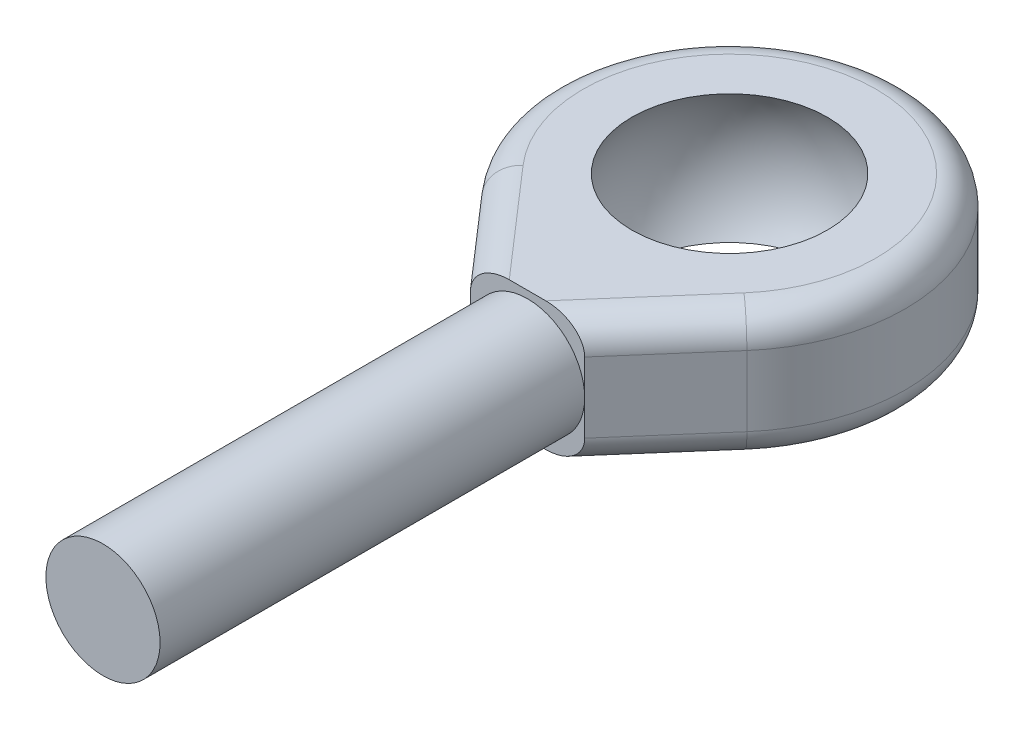
ISO-10303-21;
HEADER;
FILE_DESCRIPTION(('STEP AP214'),'2;1');
FILE_NAME('part.step','',(''),(''),'','','');
FILE_SCHEMA(('AUTOMOTIVE_DESIGN { 1 0 10303 214 1 1 1 1 }'));
ENDSEC;
DATA;
#1=APPLICATION_CONTEXT('core data for automotive mechanical design processes');
#2=APPLICATION_PROTOCOL_DEFINITION('international standard','automotive_design',2000,#1);
#3=PRODUCT_CONTEXT('',#1,'mechanical');
#4=PRODUCT('Part','Part','',(#3));
#5=PRODUCT_RELATED_PRODUCT_CATEGORY('part','',(#4));
#6=PRODUCT_DEFINITION_FORMATION('','',#4);
#7=PRODUCT_DEFINITION_CONTEXT('part definition',#1,'design');
#8=PRODUCT_DEFINITION('design','',#6,#7);
#9=PRODUCT_DEFINITION_SHAPE('','',#8);
#10=(LENGTH_UNIT() NAMED_UNIT(*) SI_UNIT(.MILLI.,.METRE.));
#11=(NAMED_UNIT(*) PLANE_ANGLE_UNIT() SI_UNIT($,.RADIAN.));
#12=(NAMED_UNIT(*) SI_UNIT($,.STERADIAN.) SOLID_ANGLE_UNIT());
#13=UNCERTAINTY_MEASURE_WITH_UNIT(LENGTH_MEASURE(1.E-05),#10,'distance_accuracy_value','');
#14=(GEOMETRIC_REPRESENTATION_CONTEXT(3) GLOBAL_UNCERTAINTY_ASSIGNED_CONTEXT((#13)) GLOBAL_UNIT_ASSIGNED_CONTEXT((#10,
#11,#12)) REPRESENTATION_CONTEXT('',''));
#15=CARTESIAN_POINT('',(0.,0.,0.));
#16=DIRECTION('',(0.,0.,1.));
#17=DIRECTION('',(1.,0.,0.));
#18=AXIS2_PLACEMENT_3D('',#15,#16,#17);
#19=CARTESIAN_POINT('',(0.,0.,42.8));
#20=DIRECTION('',(0.,0.,1.));
#21=DIRECTION('',(1.,0.,0.));
#22=AXIS2_PLACEMENT_3D('',#19,#20,#21);
#23=PLANE('',#22);
#24=CARTESIAN_POINT('',(0.,4.4,42.8));
#25=DIRECTION('',(0.,0.,1.));
#26=DIRECTION('',(1.,0.,0.));
#27=AXIS2_PLACEMENT_3D('',#24,#25,#26);
#28=CIRCLE('',#27,3.9);
#29=CARTESIAN_POINT('',(3.9,4.4,42.8));
#30=VERTEX_POINT('',#29);
#31=EDGE_CURVE('E176',#30,#30,#28,.T.);
#32=ORIENTED_EDGE('',*,*,#31,.T.);
#33=EDGE_LOOP('',(#32));
#34=FACE_BOUND('',#33,.T.);
#35=ADVANCED_FACE('F65',(#34),#23,.T.);
#36=CARTESIAN_POINT('',(0.,0.,0.));
#37=DIRECTION('',(0.,1.,0.));
#38=DIRECTION('',(0.,0.,1.));
#39=AXIS2_PLACEMENT_3D('',#36,#37,#38);
#40=PLANE('',#39);
#41=CARTESIAN_POINT('',(0.,0.,0.));
#42=DIRECTION('',(0.,1.,0.));
#43=DIRECTION('',(0.,0.,1.));
#44=AXIS2_PLACEMENT_3D('',#41,#42,#43);
#45=CIRCLE('',#44,6.68131723539603);
#46=CARTESIAN_POINT('',(0.,0.,6.68131723539603));
#47=VERTEX_POINT('',#46);
#48=EDGE_CURVE('E196',#47,#47,#45,.F.);
#49=ORIENTED_EDGE('',*,*,#48,.F.);
#50=EDGE_LOOP('',(#49));
#51=FACE_BOUND('',#50,.T.);
#52=CARTESIAN_POINT('',(0.,0.,0.));
#53=DIRECTION('',(0.,1.,0.));
#54=DIRECTION('',(0.,0.,1.));
#55=AXIS2_PLACEMENT_3D('',#52,#53,#54);
#56=CIRCLE('',#55,10.);
#57=CARTESIAN_POINT('',(-7.5445742415922,0.,6.56348988824569));
#58=VERTEX_POINT('',#57);
#59=CARTESIAN_POINT('',(7.54457424159221,0.,6.56348988824569));
#60=VERTEX_POINT('',#59);
#61=EDGE_CURVE('E207',#58,#60,#56,.F.);
#62=ORIENTED_EDGE('',*,*,#61,.T.);
#63=DIRECTION('',(-0.656348988824569,0.,0.754457424159221));
#64=VECTOR('',#63,1.);
#65=CARTESIAN_POINT('',(7.54457424159221,0.,6.56348988824568));
#66=LINE('',#65,#64);
#67=CARTESIAN_POINT('',(1.24908831703945,0.,13.8));
#68=VERTEX_POINT('',#67);
#69=EDGE_CURVE('E210',#60,#68,#66,.T.);
#70=ORIENTED_EDGE('',*,*,#69,.T.);
#71=DIRECTION('',(1.,0.,0.));
#72=VECTOR('',#71,1.);
#73=CARTESIAN_POINT('',(0.,0.,13.8));
#74=LINE('',#73,#72);
#75=CARTESIAN_POINT('',(-1.24908831703945,0.,13.8));
#76=VERTEX_POINT('',#75);
#77=EDGE_CURVE('E170',#76,#68,#74,.T.);
#78=ORIENTED_EDGE('',*,*,#77,.F.);
#79=DIRECTION('',(-0.656348988824568,0.,-0.754457424159221));
#80=VECTOR('',#79,1.);
#81=CARTESIAN_POINT('',(-7.54457424159221,0.,6.56348988824568));
#82=LINE('',#81,#80);
#83=EDGE_CURVE('E201',#76,#58,#82,.T.);
#84=ORIENTED_EDGE('',*,*,#83,.T.);
#85=EDGE_LOOP('',(#62,#70,#78,#84));
#86=FACE_BOUND('',#85,.T.);
#87=ADVANCED_FACE('F286',(#51,#86),#40,.F.);
#88=CARTESIAN_POINT('',(0.,8.8,0.));
#89=DIRECTION('',(0.,1.,0.));
#90=DIRECTION('',(0.,0.,1.));
#91=AXIS2_PLACEMENT_3D('',#88,#89,#90);
#92=PLANE('',#91);
#93=CARTESIAN_POINT('',(0.,8.8,0.));
#94=DIRECTION('',(0.,1.,0.));
#95=DIRECTION('',(0.,0.,1.));
#96=AXIS2_PLACEMENT_3D('',#93,#94,#95);
#97=CIRCLE('',#96,6.68131723539603);
#98=CARTESIAN_POINT('',(0.,8.8,6.68131723539603));
#99=VERTEX_POINT('',#98);
#100=EDGE_CURVE('E197',#99,#99,#97,.F.);
#101=ORIENTED_EDGE('',*,*,#100,.T.);
#102=EDGE_LOOP('',(#101));
#103=FACE_BOUND('',#102,.T.);
#104=DIRECTION('',(-1.,0.,0.));
#105=VECTOR('',#104,1.);
#106=CARTESIAN_POINT('',(0.,8.8,13.8));
#107=LINE('',#106,#105);
#108=CARTESIAN_POINT('',(1.24908831703945,8.8,13.8));
#109=VERTEX_POINT('',#108);
#110=CARTESIAN_POINT('',(-1.24908831703945,8.8,13.8));
#111=VERTEX_POINT('',#110);
#112=EDGE_CURVE('E150',#109,#111,#107,.T.);
#113=ORIENTED_EDGE('',*,*,#112,.F.);
#114=DIRECTION('',(0.656348988824569,0.,-0.754457424159221));
#115=VECTOR('',#114,1.);
#116=CARTESIAN_POINT('',(7.54457424159221,8.8,6.56348988824568));
#117=LINE('',#116,#115);
#118=CARTESIAN_POINT('',(7.54457424159221,8.8,6.56348988824569));
#119=VERTEX_POINT('',#118);
#120=EDGE_CURVE('E238',#109,#119,#117,.T.);
#121=ORIENTED_EDGE('',*,*,#120,.T.);
#122=CARTESIAN_POINT('',(0.,8.8,0.));
#123=DIRECTION('',(0.,1.,0.));
#124=DIRECTION('',(0.,0.,1.));
#125=AXIS2_PLACEMENT_3D('',#122,#123,#124);
#126=CIRCLE('',#125,10.);
#127=CARTESIAN_POINT('',(-7.5445742415922,8.8,6.56348988824568));
#128=VERTEX_POINT('',#127);
#129=EDGE_CURVE('E235',#119,#128,#126,.T.);
#130=ORIENTED_EDGE('',*,*,#129,.T.);
#131=DIRECTION('',(0.656348988824568,0.,0.754457424159221));
#132=VECTOR('',#131,1.);
#133=CARTESIAN_POINT('',(-2.39108515168156,8.8,12.4873020223508));
#134=LINE('',#133,#132);
#135=EDGE_CURVE('E232',#128,#111,#134,.T.);
#136=ORIENTED_EDGE('',*,*,#135,.T.);
#137=EDGE_LOOP('',(#113,#121,#130,#136));
#138=FACE_BOUND('',#137,.T.);
#139=ADVANCED_FACE('F266',(#103,#138),#92,.T.);
#140=CARTESIAN_POINT('',(9.05348908991065,0.,7.87618786589482));
#141=DIRECTION('',(-0.754457424159221,0.,-0.656348988824569));
#142=DIRECTION('',(-0.656348988824569,0.,0.754457424159221));
#143=AXIS2_PLACEMENT_3D('',#140,#141,#142);
#144=PLANE('',#143);
#145=DIRECTION('',(0.,1.,0.));
#146=VECTOR('',#145,1.);
#147=CARTESIAN_POINT('',(3.9,0.,13.8));
#148=LINE('',#147,#146);
#149=CARTESIAN_POINT('',(3.9,2.,13.8));
#150=VERTEX_POINT('',#149);
#151=CARTESIAN_POINT('',(3.9,4.4,13.8));
#152=VERTEX_POINT('',#151);
#153=EDGE_CURVE('E161',#150,#152,#148,.T.);
#154=ORIENTED_EDGE('',*,*,#153,.F.);
#155=DIRECTION('',(-0.656348988824569,0.,0.754457424159221));
#156=VECTOR('',#155,1.);
#157=CARTESIAN_POINT('',(9.05348908991065,2.,7.87618786589482));
#158=LINE('',#157,#156);
#159=CARTESIAN_POINT('',(9.05348908991065,2.,7.87618786589482));
#160=VERTEX_POINT('',#159);
#161=EDGE_CURVE('E223',#150,#160,#158,.F.);
#162=ORIENTED_EDGE('',*,*,#161,.T.);
#163=DIRECTION('',(0.,1.,0.));
#164=VECTOR('',#163,1.);
#165=CARTESIAN_POINT('',(9.05348908991065,0.,7.87618786589482));
#166=LINE('',#165,#164);
#167=CARTESIAN_POINT('',(9.05348908991065,6.8,7.87618786589482));
#168=VERTEX_POINT('',#167);
#169=EDGE_CURVE('E192',#160,#168,#166,.T.);
#170=ORIENTED_EDGE('',*,*,#169,.T.);
#171=DIRECTION('',(0.656348988824569,0.,-0.754457424159221));
#172=VECTOR('',#171,1.);
#173=CARTESIAN_POINT('',(3.9,6.8,13.8));
#174=LINE('',#173,#172);
#175=CARTESIAN_POINT('',(3.9,6.8,13.8));
#176=VERTEX_POINT('',#175);
#177=EDGE_CURVE('E220',#168,#176,#174,.F.);
#178=ORIENTED_EDGE('',*,*,#177,.T.);
#179=DIRECTION('',(0.,1.,0.));
#180=VECTOR('',#179,1.);
#181=CARTESIAN_POINT('',(3.9,0.,13.8));
#182=LINE('',#181,#180);
#183=EDGE_CURVE('E175',#152,#176,#182,.T.);
#184=ORIENTED_EDGE('',*,*,#183,.F.);
#185=EDGE_LOOP('',(#154,#162,#170,#178,#184));
#186=FACE_BOUND('',#185,.T.);
#187=ADVANCED_FACE('F270',(#186),#144,.F.);
#188=CARTESIAN_POINT('',(-3.9,0.,13.8));
#189=DIRECTION('',(0.754457424159221,0.,-0.656348988824568));
#190=DIRECTION('',(-0.656348988824568,0.,-0.754457424159221));
#191=AXIS2_PLACEMENT_3D('',#188,#189,#190);
#192=PLANE('',#191);
#193=DIRECTION('',(0.,1.,0.));
#194=VECTOR('',#193,1.);
#195=CARTESIAN_POINT('',(-9.05348908991065,0.,7.87618786589482));
#196=LINE('',#195,#194);
#197=CARTESIAN_POINT('',(-9.05348908991065,2.,7.87618786589482));
#198=VERTEX_POINT('',#197);
#199=CARTESIAN_POINT('',(-9.05348908991065,6.8,7.87618786589482));
#200=VERTEX_POINT('',#199);
#201=EDGE_CURVE('E149',#198,#200,#196,.T.);
#202=ORIENTED_EDGE('',*,*,#201,.F.);
#203=DIRECTION('',(-0.656348988824568,0.,-0.754457424159221));
#204=VECTOR('',#203,1.);
#205=CARTESIAN_POINT('',(-3.9,2.,13.8));
#206=LINE('',#205,#204);
#207=CARTESIAN_POINT('',(-3.9,2.,13.8));
#208=VERTEX_POINT('',#207);
#209=EDGE_CURVE('E12',#198,#208,#206,.F.);
#210=ORIENTED_EDGE('',*,*,#209,.T.);
#211=DIRECTION('',(0.,1.,0.));
#212=VECTOR('',#211,1.);
#213=CARTESIAN_POINT('',(-3.9,0.,13.8));
#214=LINE('',#213,#212);
#215=CARTESIAN_POINT('',(-3.9,4.4,13.8));
#216=VERTEX_POINT('',#215);
#217=EDGE_CURVE('E153',#208,#216,#214,.T.);
#218=ORIENTED_EDGE('',*,*,#217,.T.);
#219=DIRECTION('',(0.,-1.,0.));
#220=VECTOR('',#219,1.);
#221=CARTESIAN_POINT('',(-3.9,0.,13.8));
#222=LINE('',#221,#220);
#223=CARTESIAN_POINT('',(-3.9,6.8,13.8));
#224=VERTEX_POINT('',#223);
#225=EDGE_CURVE('E139',#224,#216,#222,.T.);
#226=ORIENTED_EDGE('',*,*,#225,.F.);
#227=DIRECTION('',(0.656348988824568,0.,0.754457424159221));
#228=VECTOR('',#227,1.);
#229=CARTESIAN_POINT('',(-9.05348908991065,6.8,7.87618786589482));
#230=LINE('',#229,#228);
#231=EDGE_CURVE('E75',#224,#200,#230,.F.);
#232=ORIENTED_EDGE('',*,*,#231,.T.);
#233=EDGE_LOOP('',(#202,#210,#218,#226,#232));
#234=FACE_BOUND('',#233,.T.);
#235=ADVANCED_FACE('F156',(#234),#192,.F.);
#236=CARTESIAN_POINT('',(0.,8.8,0.));
#237=DIRECTION('',(0.,-1.,0.));
#238=DIRECTION('',(0.,0.,-1.));
#239=AXIS2_PLACEMENT_3D('',#236,#237,#238);
#240=CYLINDRICAL_SURFACE('',#239,12.);
#241=ORIENTED_EDGE('',*,*,#169,.F.);
#242=CARTESIAN_POINT('',(0.,2.,0.));
#243=DIRECTION('',(0.,1.,0.));
#244=DIRECTION('',(0.,0.,1.));
#245=AXIS2_PLACEMENT_3D('',#242,#243,#244);
#246=CIRCLE('',#245,12.);
#247=EDGE_CURVE('E229',#160,#198,#246,.T.);
#248=ORIENTED_EDGE('',*,*,#247,.T.);
#249=ORIENTED_EDGE('',*,*,#201,.T.);
#250=CARTESIAN_POINT('',(0.,6.8,0.));
#251=DIRECTION('',(0.,1.,0.));
#252=DIRECTION('',(0.,0.,1.));
#253=AXIS2_PLACEMENT_3D('',#250,#251,#252);
#254=CIRCLE('',#253,12.);
#255=EDGE_CURVE('E226',#200,#168,#254,.F.);
#256=ORIENTED_EDGE('',*,*,#255,.T.);
#257=EDGE_LOOP('',(#241,#248,#249,#256));
#258=FACE_BOUND('',#257,.T.);
#259=ADVANCED_FACE('F275',(#258),#240,.T.);
#260=CARTESIAN_POINT('',(0.,4.4,0.));
#261=DIRECTION('',(-1.,0.,0.));
#262=DIRECTION('',(0.,0.,-1.));
#263=AXIS2_PLACEMENT_3D('',#260,#261,#262);
#264=SPHERICAL_SURFACE('',#263,8.);
#265=CARTESIAN_POINT('',(0.,4.4,0.));
#266=DIRECTION('',(0.,1.,0.));
#267=DIRECTION('',(0.,0.,1.));
#268=AXIS2_PLACEMENT_3D('',#265,#266,#267);
#269=SPHERICAL_SURFACE('',#268,8.);
#270=ORIENTED_EDGE('',*,*,#100,.F.);
#271=EDGE_LOOP('',(#270));
#272=FACE_BOUND('',#271,.T.);
#273=ORIENTED_EDGE('',*,*,#48,.T.);
#274=EDGE_LOOP('',(#273));
#275=FACE_BOUND('',#274,.T.);
#276=ADVANCED_FACE('F311',(#272,#275),#269,.F.);
#277=CARTESIAN_POINT('',(0.,4.4,13.8));
#278=DIRECTION('',(0.,0.,1.));
#279=DIRECTION('',(1.,0.,0.));
#280=AXIS2_PLACEMENT_3D('',#277,#278,#279);
#281=CYLINDRICAL_SURFACE('',#280,3.9);
#282=ORIENTED_EDGE('',*,*,#31,.F.);
#283=EDGE_LOOP('',(#282));
#284=FACE_BOUND('',#283,.T.);
#285=CARTESIAN_POINT('',(0.,4.4,13.8));
#286=DIRECTION('',(0.,0.,1.));
#287=DIRECTION('',(1.,0.,0.));
#288=AXIS2_PLACEMENT_3D('',#285,#286,#287);
#289=CIRCLE('',#288,3.9);
#290=EDGE_CURVE('E164',#216,#152,#289,.T.);
#291=ORIENTED_EDGE('',*,*,#290,.T.);
#292=CARTESIAN_POINT('',(0.,4.4,13.8));
#293=DIRECTION('',(0.,0.,1.));
#294=DIRECTION('',(1.,0.,0.));
#295=AXIS2_PLACEMENT_3D('',#292,#293,#294);
#296=CIRCLE('',#295,3.9);
#297=EDGE_CURVE('E144',#152,#216,#296,.T.);
#298=ORIENTED_EDGE('',*,*,#297,.T.);
#299=EDGE_LOOP('',(#291,#298));
#300=FACE_BOUND('',#299,.T.);
#301=ADVANCED_FACE('F173',(#284,#300),#281,.T.);
#302=CARTESIAN_POINT('',(0.,0.,13.8));
#303=DIRECTION('',(0.,0.,1.));
#304=DIRECTION('',(1.,0.,0.));
#305=AXIS2_PLACEMENT_3D('',#302,#303,#304);
#306=PLANE('',#305);
#307=ORIENTED_EDGE('',*,*,#183,.T.);
#308=CARTESIAN_POINT('',(1.24908831703945,6.8,13.8));
#309=DIRECTION('',(0.,0.,1.));
#310=DIRECTION('',(-1.,0.,0.));
#311=AXIS2_PLACEMENT_3D('',#308,#309,#310);
#312=ELLIPSE('',#311,2.65091168296055,2.);
#313=EDGE_CURVE('E244',#176,#109,#312,.T.);
#314=ORIENTED_EDGE('',*,*,#313,.T.);
#315=ORIENTED_EDGE('',*,*,#112,.T.);
#316=CARTESIAN_POINT('',(-1.24908831703945,6.8,13.8));
#317=DIRECTION('',(0.,0.,1.));
#318=DIRECTION('',(-1.,0.,0.));
#319=AXIS2_PLACEMENT_3D('',#316,#317,#318);
#320=ELLIPSE('',#319,2.65091168296055,2.);
#321=EDGE_CURVE('E83',#111,#224,#320,.T.);
#322=ORIENTED_EDGE('',*,*,#321,.T.);
#323=ORIENTED_EDGE('',*,*,#225,.T.);
#324=ORIENTED_EDGE('',*,*,#297,.F.);
#325=EDGE_LOOP('',(#307,#314,#315,#322,#323,#324));
#326=FACE_BOUND('',#325,.T.);
#327=ADVANCED_FACE('F142',(#326),#306,.T.);
#328=CARTESIAN_POINT('',(0.,0.,13.8));
#329=DIRECTION('',(0.,0.,1.));
#330=DIRECTION('',(1.,0.,0.));
#331=AXIS2_PLACEMENT_3D('',#328,#329,#330);
#332=PLANE('',#331);
#333=ORIENTED_EDGE('',*,*,#77,.T.);
#334=CARTESIAN_POINT('',(1.24908831703945,2.,13.8));
#335=DIRECTION('',(0.,0.,1.));
#336=DIRECTION('',(-1.,0.,0.));
#337=AXIS2_PLACEMENT_3D('',#334,#335,#336);
#338=ELLIPSE('',#337,2.65091168296055,2.);
#339=EDGE_CURVE('E217',#68,#150,#338,.T.);
#340=ORIENTED_EDGE('',*,*,#339,.T.);
#341=ORIENTED_EDGE('',*,*,#153,.T.);
#342=ORIENTED_EDGE('',*,*,#290,.F.);
#343=ORIENTED_EDGE('',*,*,#217,.F.);
#344=CARTESIAN_POINT('',(-1.24908831703945,2.,13.8));
#345=DIRECTION('',(0.,0.,1.));
#346=DIRECTION('',(-1.,0.,0.));
#347=AXIS2_PLACEMENT_3D('',#344,#345,#346);
#348=ELLIPSE('',#347,2.65091168296055,2.);
#349=EDGE_CURVE('E214',#208,#76,#348,.T.);
#350=ORIENTED_EDGE('',*,*,#349,.T.);
#351=EDGE_LOOP('',(#333,#340,#341,#342,#343,#350));
#352=FACE_BOUND('',#351,.T.);
#353=ADVANCED_FACE('F166',(#352),#332,.T.);
#354=CARTESIAN_POINT('',(-7.54457424159221,2.,6.56348988824568));
#355=DIRECTION('',(-0.656348988824568,0.,-0.754457424159221));
#356=DIRECTION('',(-0.754457424159221,0.,0.656348988824568));
#357=AXIS2_PLACEMENT_3D('',#354,#355,#356);
#358=CYLINDRICAL_SURFACE('',#357,2.);
#359=ORIENTED_EDGE('',*,*,#349,.F.);
#360=ORIENTED_EDGE('',*,*,#209,.F.);
#361=CARTESIAN_POINT('',(-7.5445742415922,2.,6.56348988824569));
#362=DIRECTION('',(-0.656348988824568,0.,-0.754457424159221));
#363=DIRECTION('',(-0.754457424159221,0.,0.656348988824568));
#364=AXIS2_PLACEMENT_3D('',#361,#362,#363);
#365=CIRCLE('',#364,2.);
#366=EDGE_CURVE('E171',#58,#198,#365,.T.);
#367=ORIENTED_EDGE('',*,*,#366,.F.);
#368=ORIENTED_EDGE('',*,*,#83,.F.);
#369=EDGE_LOOP('',(#359,#360,#367,#368));
#370=FACE_BOUND('',#369,.T.);
#371=ADVANCED_FACE('F290',(#370),#358,.T.);
#372=CARTESIAN_POINT('',(0.,2.,0.));
#373=DIRECTION('',(0.,1.,0.));
#374=DIRECTION('',(0.,0.,1.));
#375=AXIS2_PLACEMENT_3D('',#372,#373,#374);
#376=TOROIDAL_SURFACE('',#375,10.,2.);
#377=ORIENTED_EDGE('',*,*,#366,.T.);
#378=ORIENTED_EDGE('',*,*,#247,.F.);
#379=CARTESIAN_POINT('',(7.54457424159221,2.,6.56348988824569));
#380=DIRECTION('',(-0.656348988824568,0.,0.754457424159221));
#381=DIRECTION('',(0.754457424159221,0.,0.656348988824568));
#382=AXIS2_PLACEMENT_3D('',#379,#380,#381);
#383=CIRCLE('',#382,2.);
#384=EDGE_CURVE('E249',#60,#160,#383,.T.);
#385=ORIENTED_EDGE('',*,*,#384,.F.);
#386=ORIENTED_EDGE('',*,*,#61,.F.);
#387=EDGE_LOOP('',(#377,#378,#385,#386));
#388=FACE_BOUND('',#387,.T.);
#389=ADVANCED_FACE('F278',(#388),#376,.T.);
#390=CARTESIAN_POINT('',(7.54457424159221,2.,6.56348988824568));
#391=DIRECTION('',(-0.656348988824569,0.,0.754457424159221));
#392=DIRECTION('',(0.754457424159221,0.,0.656348988824569));
#393=AXIS2_PLACEMENT_3D('',#390,#391,#392);
#394=CYLINDRICAL_SURFACE('',#393,2.);
#395=ORIENTED_EDGE('',*,*,#384,.T.);
#396=ORIENTED_EDGE('',*,*,#161,.F.);
#397=ORIENTED_EDGE('',*,*,#339,.F.);
#398=ORIENTED_EDGE('',*,*,#69,.F.);
#399=EDGE_LOOP('',(#395,#396,#397,#398));
#400=FACE_BOUND('',#399,.T.);
#401=ADVANCED_FACE('F283',(#400),#394,.T.);
#402=CARTESIAN_POINT('',(-7.54457424159221,6.8,6.56348988824568));
#403=DIRECTION('',(-0.656348988824568,0.,-0.754457424159221));
#404=DIRECTION('',(-0.754457424159221,0.,0.656348988824568));
#405=AXIS2_PLACEMENT_3D('',#402,#403,#404);
#406=CYLINDRICAL_SURFACE('',#405,2.);
#407=ORIENTED_EDGE('',*,*,#321,.F.);
#408=ORIENTED_EDGE('',*,*,#135,.F.);
#409=CARTESIAN_POINT('',(-7.5445742415922,6.8,6.56348988824569));
#410=DIRECTION('',(-0.656348988824568,0.,-0.754457424159221));
#411=DIRECTION('',(-0.754457424159221,0.,0.656348988824568));
#412=AXIS2_PLACEMENT_3D('',#409,#410,#411);
#413=CIRCLE('',#412,2.);
#414=EDGE_CURVE('E69',#200,#128,#413,.T.);
#415=ORIENTED_EDGE('',*,*,#414,.F.);
#416=ORIENTED_EDGE('',*,*,#231,.F.);
#417=EDGE_LOOP('',(#407,#408,#415,#416));
#418=FACE_BOUND('',#417,.T.);
#419=ADVANCED_FACE('F67',(#418),#406,.T.);
#420=CARTESIAN_POINT('',(0.,6.8,0.));
#421=DIRECTION('',(0.,1.,0.));
#422=DIRECTION('',(0.,0.,1.));
#423=AXIS2_PLACEMENT_3D('',#420,#421,#422);
#424=TOROIDAL_SURFACE('',#423,10.,2.);
#425=ORIENTED_EDGE('',*,*,#414,.T.);
#426=ORIENTED_EDGE('',*,*,#129,.F.);
#427=CARTESIAN_POINT('',(7.54457424159221,6.8,6.56348988824569));
#428=DIRECTION('',(-0.656348988824568,0.,0.754457424159221));
#429=DIRECTION('',(0.754457424159221,0.,0.656348988824568));
#430=AXIS2_PLACEMENT_3D('',#427,#428,#429);
#431=CIRCLE('',#430,2.);
#432=EDGE_CURVE('E91',#168,#119,#431,.T.);
#433=ORIENTED_EDGE('',*,*,#432,.F.);
#434=ORIENTED_EDGE('',*,*,#255,.F.);
#435=EDGE_LOOP('',(#425,#426,#433,#434));
#436=FACE_BOUND('',#435,.T.);
#437=ADVANCED_FACE('F261',(#436),#424,.T.);
#438=CARTESIAN_POINT('',(7.54457424159221,6.8,6.56348988824568));
#439=DIRECTION('',(-0.656348988824569,0.,0.754457424159221));
#440=DIRECTION('',(0.754457424159221,0.,0.656348988824569));
#441=AXIS2_PLACEMENT_3D('',#438,#439,#440);
#442=CYLINDRICAL_SURFACE('',#441,2.);
#443=ORIENTED_EDGE('',*,*,#313,.F.);
#444=ORIENTED_EDGE('',*,*,#177,.F.);
#445=ORIENTED_EDGE('',*,*,#432,.T.);
#446=ORIENTED_EDGE('',*,*,#120,.F.);
#447=EDGE_LOOP('',(#443,#444,#445,#446));
#448=FACE_BOUND('',#447,.T.);
#449=ADVANCED_FACE('F268',(#448),#442,.T.);
#450=CLOSED_SHELL('',(#35,#87,#139,#187,#235,#259,#276,#301,#327,#353,#371,#389,#401,#419,#437,#449));
#451=MANIFOLD_SOLID_BREP('B2',#450);
#452=ADVANCED_BREP_SHAPE_REPRESENTATION('',(#18,#451),#14);
#453=SHAPE_DEFINITION_REPRESENTATION(#9,#452);
ENDSEC;
END-ISO-10303-21;
